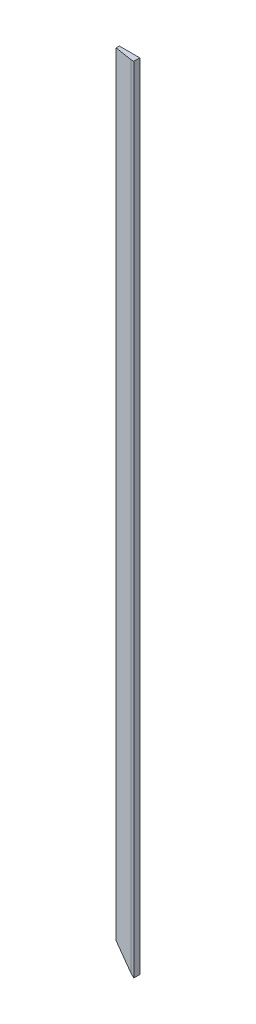
ISO-10303-21;
HEADER;
FILE_DESCRIPTION(('STEP AP214'),'2;1');
FILE_NAME('part.step','',(''),(''),'','','');
FILE_SCHEMA(('AUTOMOTIVE_DESIGN { 1 0 10303 214 1 1 1 1 }'));
ENDSEC;
DATA;
#1=APPLICATION_CONTEXT('core data for automotive mechanical design processes');
#2=APPLICATION_PROTOCOL_DEFINITION('international standard','automotive_design',2000,#1);
#3=PRODUCT_CONTEXT('',#1,'mechanical');
#4=PRODUCT('Part','Part','',(#3));
#5=PRODUCT_RELATED_PRODUCT_CATEGORY('part','',(#4));
#6=PRODUCT_DEFINITION_FORMATION('','',#4);
#7=PRODUCT_DEFINITION_CONTEXT('part definition',#1,'design');
#8=PRODUCT_DEFINITION('design','',#6,#7);
#9=PRODUCT_DEFINITION_SHAPE('','',#8);
#10=(LENGTH_UNIT() NAMED_UNIT(*) SI_UNIT(.MILLI.,.METRE.));
#11=(NAMED_UNIT(*) PLANE_ANGLE_UNIT() SI_UNIT($,.RADIAN.));
#12=(NAMED_UNIT(*) SI_UNIT($,.STERADIAN.) SOLID_ANGLE_UNIT());
#13=UNCERTAINTY_MEASURE_WITH_UNIT(LENGTH_MEASURE(1.E-05),#10,'distance_accuracy_value','');
#14=(GEOMETRIC_REPRESENTATION_CONTEXT(3) GLOBAL_UNCERTAINTY_ASSIGNED_CONTEXT((#13)) GLOBAL_UNIT_ASSIGNED_CONTEXT((#10,
#11,#12)) REPRESENTATION_CONTEXT('',''));
#15=CARTESIAN_POINT('',(0.,0.,0.));
#16=DIRECTION('',(0.,0.,1.));
#17=DIRECTION('',(1.,0.,0.));
#18=AXIS2_PLACEMENT_3D('',#15,#16,#17);
#19=CARTESIAN_POINT('',(0.,2092.325,8.255));
#20=DIRECTION('',(1.,0.,0.));
#21=DIRECTION('',(0.,0.,-1.));
#22=AXIS2_PLACEMENT_3D('',#19,#20,#21);
#23=PLANE('',#22);
#24=DIRECTION('',(0.,-1.,0.));
#25=VECTOR('',#24,1.);
#26=CARTESIAN_POINT('',(0.,2092.325,0.));
#27=LINE('',#26,#25);
#28=CARTESIAN_POINT('',(0.,2092.325,0.));
#29=VERTEX_POINT('',#28);
#30=CARTESIAN_POINT('',(0.,53.9750000000003,0.));
#31=VERTEX_POINT('',#30);
#32=EDGE_CURVE('E90',#29,#31,#27,.T.);
#33=ORIENTED_EDGE('',*,*,#32,.T.);
#34=DIRECTION('',(0.,0.,1.));
#35=VECTOR('',#34,1.);
#36=CARTESIAN_POINT('',(0.,53.9750000000003,0.));
#37=LINE('',#36,#35);
#38=CARTESIAN_POINT('',(0.,53.9750000000003,8.25499999999996));
#39=VERTEX_POINT('',#38);
#40=EDGE_CURVE('E76',#31,#39,#37,.T.);
#41=ORIENTED_EDGE('',*,*,#40,.T.);
#42=DIRECTION('',(0.,-1.,0.));
#43=VECTOR('',#42,1.);
#44=CARTESIAN_POINT('',(0.,2092.325,8.255));
#45=LINE('',#44,#43);
#46=CARTESIAN_POINT('',(0.,2092.325,8.255));
#47=VERTEX_POINT('',#46);
#48=EDGE_CURVE('E11',#47,#39,#45,.T.);
#49=ORIENTED_EDGE('',*,*,#48,.F.);
#50=DIRECTION('',(0.,0.,1.));
#51=VECTOR('',#50,1.);
#52=CARTESIAN_POINT('',(0.,2092.325,8.255));
#53=LINE('',#52,#51);
#54=EDGE_CURVE('E96',#29,#47,#53,.T.);
#55=ORIENTED_EDGE('',*,*,#54,.F.);
#56=EDGE_LOOP('',(#33,#41,#49,#55));
#57=FACE_BOUND('',#56,.T.);
#58=ADVANCED_FACE('F34',(#57),#23,.F.);
#59=CARTESIAN_POINT('',(46.355,2092.325,15.875));
#60=DIRECTION('',(0.162206600298323,0.,-0.986756818481464));
#61=DIRECTION('',(-0.986756818481464,0.,-0.162206600298323));
#62=AXIS2_PLACEMENT_3D('',#59,#60,#61);
#63=PLANE('',#62);
#64=ORIENTED_EDGE('',*,*,#48,.T.);
#65=DIRECTION('',(0.702377795543574,-0.702377795543578,0.115459363650998));
#66=VECTOR('',#65,1.);
#67=CARTESIAN_POINT('',(-982.102039900018,1036.07703990002,-153.186431216441));
#68=LINE('',#67,#66);
#69=CARTESIAN_POINT('',(46.3549999999998,7.62000000000021,15.875));
#70=VERTEX_POINT('',#69);
#71=EDGE_CURVE('E82',#39,#70,#68,.T.);
#72=ORIENTED_EDGE('',*,*,#71,.T.);
#73=DIRECTION('',(0.,-1.,0.));
#74=VECTOR('',#73,1.);
#75=CARTESIAN_POINT('',(46.355,2092.325,15.875));
#76=LINE('',#75,#74);
#77=CARTESIAN_POINT('',(46.355,2092.325,15.875));
#78=VERTEX_POINT('',#77);
#79=EDGE_CURVE('E42',#78,#70,#76,.T.);
#80=ORIENTED_EDGE('',*,*,#79,.F.);
#81=DIRECTION('',(0.986756818481464,0.,0.162206600298323));
#82=VECTOR('',#81,1.);
#83=CARTESIAN_POINT('',(46.355,2092.325,15.875));
#84=LINE('',#83,#82);
#85=EDGE_CURVE('E116',#47,#78,#84,.T.);
#86=ORIENTED_EDGE('',*,*,#85,.F.);
#87=EDGE_LOOP('',(#64,#72,#80,#86));
#88=FACE_BOUND('',#87,.T.);
#89=ADVANCED_FACE('F115',(#88),#63,.F.);
#90=CARTESIAN_POINT('',(53.975,2092.325,15.875));
#91=DIRECTION('',(0.,0.,-1.));
#92=DIRECTION('',(-1.,0.,0.));
#93=AXIS2_PLACEMENT_3D('',#90,#91,#92);
#94=PLANE('',#93);
#95=ORIENTED_EDGE('',*,*,#79,.T.);
#96=DIRECTION('',(-0.707106781186545,0.70710678118655,0.));
#97=VECTOR('',#96,1.);
#98=CARTESIAN_POINT('',(53.975,0.,15.875));
#99=LINE('',#98,#97);
#100=CARTESIAN_POINT('',(53.975,0.,15.875));
#101=VERTEX_POINT('',#100);
#102=EDGE_CURVE('E94',#101,#70,#99,.T.);
#103=ORIENTED_EDGE('',*,*,#102,.F.);
#104=DIRECTION('',(0.,-1.,0.));
#105=VECTOR('',#104,1.);
#106=CARTESIAN_POINT('',(53.975,2092.325,15.875));
#107=LINE('',#106,#105);
#108=CARTESIAN_POINT('',(53.975,2092.325,15.875));
#109=VERTEX_POINT('',#108);
#110=EDGE_CURVE('E98',#109,#101,#107,.T.);
#111=ORIENTED_EDGE('',*,*,#110,.F.);
#112=DIRECTION('',(1.,0.,0.));
#113=VECTOR('',#112,1.);
#114=CARTESIAN_POINT('',(53.975,2092.325,15.875));
#115=LINE('',#114,#113);
#116=EDGE_CURVE('E113',#78,#109,#115,.T.);
#117=ORIENTED_EDGE('',*,*,#116,.F.);
#118=EDGE_LOOP('',(#95,#103,#111,#117));
#119=FACE_BOUND('',#118,.T.);
#120=ADVANCED_FACE('F111',(#119),#94,.F.);
#121=CARTESIAN_POINT('',(53.975,2092.325,0.));
#122=DIRECTION('',(-1.,0.,0.));
#123=DIRECTION('',(0.,0.,1.));
#124=AXIS2_PLACEMENT_3D('',#121,#122,#123);
#125=PLANE('',#124);
#126=DIRECTION('',(0.,0.,-1.));
#127=VECTOR('',#126,1.);
#128=CARTESIAN_POINT('',(53.975,0.,0.));
#129=LINE('',#128,#127);
#130=CARTESIAN_POINT('',(53.975,0.,0.));
#131=VERTEX_POINT('',#130);
#132=EDGE_CURVE('E103',#101,#131,#129,.T.);
#133=ORIENTED_EDGE('',*,*,#132,.T.);
#134=DIRECTION('',(0.,-1.,0.));
#135=VECTOR('',#134,1.);
#136=CARTESIAN_POINT('',(53.975,2092.325,0.));
#137=LINE('',#136,#135);
#138=CARTESIAN_POINT('',(53.975,2092.325,0.));
#139=VERTEX_POINT('',#138);
#140=EDGE_CURVE('E93',#139,#131,#137,.T.);
#141=ORIENTED_EDGE('',*,*,#140,.F.);
#142=DIRECTION('',(0.,0.,-1.));
#143=VECTOR('',#142,1.);
#144=CARTESIAN_POINT('',(53.975,2092.325,0.));
#145=LINE('',#144,#143);
#146=EDGE_CURVE('E100',#109,#139,#145,.T.);
#147=ORIENTED_EDGE('',*,*,#146,.F.);
#148=ORIENTED_EDGE('',*,*,#110,.T.);
#149=EDGE_LOOP('',(#133,#141,#147,#148));
#150=FACE_BOUND('',#149,.T.);
#151=ADVANCED_FACE('F126',(#150),#125,.F.);
#152=CARTESIAN_POINT('',(0.,2092.325,0.));
#153=DIRECTION('',(0.,0.,1.));
#154=DIRECTION('',(1.,0.,0.));
#155=AXIS2_PLACEMENT_3D('',#152,#153,#154);
#156=PLANE('',#155);
#157=ORIENTED_EDGE('',*,*,#140,.T.);
#158=DIRECTION('',(-0.707106781186545,0.70710678118655,0.));
#159=VECTOR('',#158,1.);
#160=CARTESIAN_POINT('',(53.975,0.,0.));
#161=LINE('',#160,#159);
#162=EDGE_CURVE('E79',#131,#31,#161,.T.);
#163=ORIENTED_EDGE('',*,*,#162,.T.);
#164=ORIENTED_EDGE('',*,*,#32,.F.);
#165=DIRECTION('',(-1.,0.,0.));
#166=VECTOR('',#165,1.);
#167=CARTESIAN_POINT('',(0.,2092.325,0.));
#168=LINE('',#167,#166);
#169=EDGE_CURVE('E49',#139,#29,#168,.T.);
#170=ORIENTED_EDGE('',*,*,#169,.F.);
#171=EDGE_LOOP('',(#157,#163,#164,#170));
#172=FACE_BOUND('',#171,.T.);
#173=ADVANCED_FACE('F89',(#172),#156,.F.);
#174=CARTESIAN_POINT('',(0.,2092.325,0.));
#175=DIRECTION('',(0.,-1.,0.));
#176=DIRECTION('',(0.,0.,-1.));
#177=AXIS2_PLACEMENT_3D('',#174,#175,#176);
#178=PLANE('',#177);
#179=ORIENTED_EDGE('',*,*,#54,.T.);
#180=ORIENTED_EDGE('',*,*,#85,.T.);
#181=ORIENTED_EDGE('',*,*,#116,.T.);
#182=ORIENTED_EDGE('',*,*,#146,.T.);
#183=ORIENTED_EDGE('',*,*,#169,.T.);
#184=EDGE_LOOP('',(#179,#180,#181,#182,#183));
#185=FACE_BOUND('',#184,.T.);
#186=ADVANCED_FACE('F124',(#185),#178,.F.);
#187=CARTESIAN_POINT('',(53.975,0.,0.));
#188=DIRECTION('',(0.70710678118655,0.707106781186545,0.));
#189=DIRECTION('',(-0.707106781186545,0.70710678118655,0.));
#190=AXIS2_PLACEMENT_3D('',#187,#188,#189);
#191=PLANE('',#190);
#192=ORIENTED_EDGE('',*,*,#40,.F.);
#193=ORIENTED_EDGE('',*,*,#162,.F.);
#194=ORIENTED_EDGE('',*,*,#132,.F.);
#195=ORIENTED_EDGE('',*,*,#102,.T.);
#196=ORIENTED_EDGE('',*,*,#71,.F.);
#197=EDGE_LOOP('',(#192,#193,#194,#195,#196));
#198=FACE_BOUND('',#197,.T.);
#199=ADVANCED_FACE('F78',(#198),#191,.F.);
#200=CLOSED_SHELL('',(#58,#89,#120,#151,#173,#186,#199));
#201=MANIFOLD_SOLID_BREP('B2',#200);
#202=ADVANCED_BREP_SHAPE_REPRESENTATION('',(#18,#201),#14);
#203=SHAPE_DEFINITION_REPRESENTATION(#9,#202);
ENDSEC;
END-ISO-10303-21;
